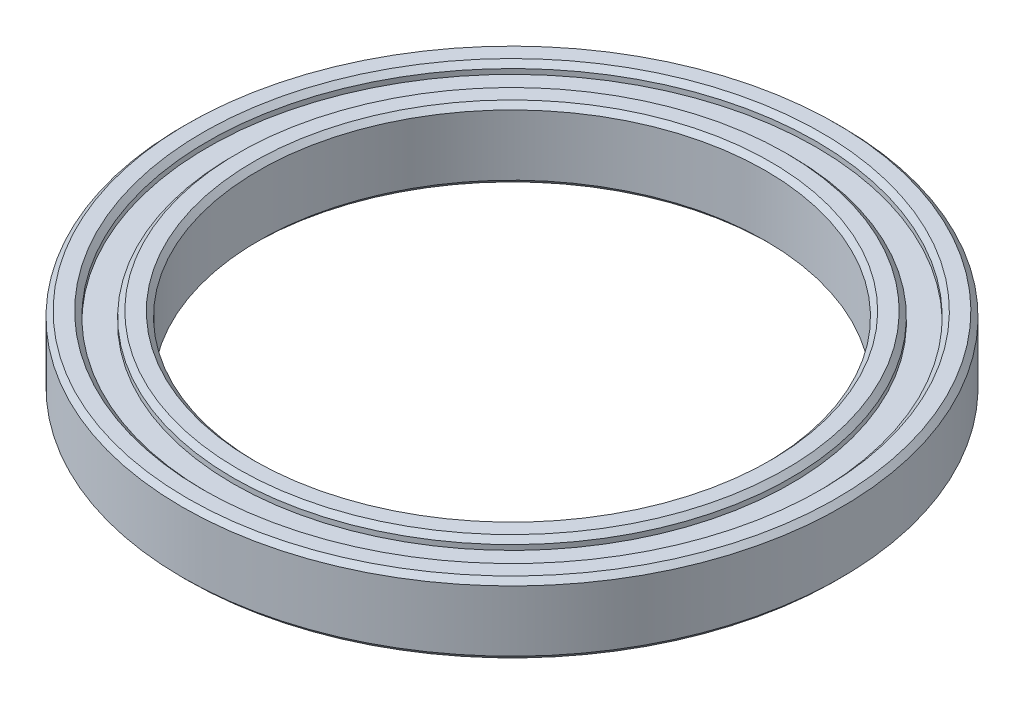
ISO-10303-21;
HEADER;
FILE_DESCRIPTION(('STEP AP214'),'2;1');
FILE_NAME('part.step','',(''),(''),'','','');
FILE_SCHEMA(('AUTOMOTIVE_DESIGN { 1 0 10303 214 1 1 1 1 }'));
ENDSEC;
DATA;
#1=APPLICATION_CONTEXT('core data for automotive mechanical design processes');
#2=APPLICATION_PROTOCOL_DEFINITION('international standard','automotive_design',2000,#1);
#3=PRODUCT_CONTEXT('',#1,'mechanical');
#4=PRODUCT('Part','Part','',(#3));
#5=PRODUCT_RELATED_PRODUCT_CATEGORY('part','',(#4));
#6=PRODUCT_DEFINITION_FORMATION('','',#4);
#7=PRODUCT_DEFINITION_CONTEXT('part definition',#1,'design');
#8=PRODUCT_DEFINITION('design','',#6,#7);
#9=PRODUCT_DEFINITION_SHAPE('','',#8);
#10=(LENGTH_UNIT() NAMED_UNIT(*) SI_UNIT(.MILLI.,.METRE.));
#11=(NAMED_UNIT(*) PLANE_ANGLE_UNIT() SI_UNIT($,.RADIAN.));
#12=(NAMED_UNIT(*) SI_UNIT($,.STERADIAN.) SOLID_ANGLE_UNIT());
#13=UNCERTAINTY_MEASURE_WITH_UNIT(LENGTH_MEASURE(1.E-05),#10,'distance_accuracy_value','');
#14=(GEOMETRIC_REPRESENTATION_CONTEXT(3) GLOBAL_UNCERTAINTY_ASSIGNED_CONTEXT((#13)) GLOBAL_UNIT_ASSIGNED_CONTEXT((#10,
#11,#12)) REPRESENTATION_CONTEXT('',''));
#15=CARTESIAN_POINT('',(0.,0.,0.));
#16=DIRECTION('',(0.,0.,1.));
#17=DIRECTION('',(1.,0.,0.));
#18=AXIS2_PLACEMENT_3D('',#15,#16,#17);
#19=CARTESIAN_POINT('',(0.,0.,0.));
#20=DIRECTION('',(0.,1.,0.));
#21=DIRECTION('',(0.,0.,1.));
#22=AXIS2_PLACEMENT_3D('',#19,#20,#21);
#23=PLANE('',#22);
#24=CARTESIAN_POINT('',(0.,0.,0.));
#25=DIRECTION('',(0.,1.,0.));
#26=DIRECTION('',(0.,0.,1.));
#27=AXIS2_PLACEMENT_3D('',#24,#25,#26);
#28=CIRCLE('',#27,27.);
#29=CARTESIAN_POINT('',(0.,0.,27.));
#30=VERTEX_POINT('',#29);
#31=EDGE_CURVE('E94',#30,#30,#28,.F.);
#32=ORIENTED_EDGE('',*,*,#31,.T.);
#33=EDGE_LOOP('',(#32));
#34=FACE_BOUND('',#33,.T.);
#35=CARTESIAN_POINT('',(0.,0.,0.));
#36=DIRECTION('',(0.,1.,0.));
#37=DIRECTION('',(0.,0.,1.));
#38=AXIS2_PLACEMENT_3D('',#35,#36,#37);
#39=CIRCLE('',#38,25.5);
#40=CARTESIAN_POINT('',(0.,0.,25.5));
#41=VERTEX_POINT('',#40);
#42=EDGE_CURVE('E97',#41,#41,#39,.T.);
#43=ORIENTED_EDGE('',*,*,#42,.T.);
#44=EDGE_LOOP('',(#43));
#45=FACE_BOUND('',#44,.T.);
#46=ADVANCED_FACE('F43',(#34,#45),#23,.F.);
#47=CARTESIAN_POINT('',(0.,7.,0.));
#48=DIRECTION('',(0.,1.,0.));
#49=DIRECTION('',(0.,0.,1.));
#50=AXIS2_PLACEMENT_3D('',#47,#48,#49);
#51=PLANE('',#50);
#52=CARTESIAN_POINT('',(0.,7.,0.));
#53=DIRECTION('',(0.,1.,0.));
#54=DIRECTION('',(0.,0.,1.));
#55=AXIS2_PLACEMENT_3D('',#52,#53,#54);
#56=CIRCLE('',#55,27.);
#57=CARTESIAN_POINT('',(0.,7.,27.));
#58=VERTEX_POINT('',#57);
#59=EDGE_CURVE('E51',#58,#58,#56,.T.);
#60=ORIENTED_EDGE('',*,*,#59,.T.);
#61=EDGE_LOOP('',(#60));
#62=FACE_BOUND('',#61,.T.);
#63=CARTESIAN_POINT('',(0.,7.,0.));
#64=DIRECTION('',(0.,1.,0.));
#65=DIRECTION('',(0.,0.,1.));
#66=AXIS2_PLACEMENT_3D('',#63,#64,#65);
#67=CIRCLE('',#66,25.5);
#68=CARTESIAN_POINT('',(0.,7.,25.5));
#69=VERTEX_POINT('',#68);
#70=EDGE_CURVE('E55',#69,#69,#67,.F.);
#71=ORIENTED_EDGE('',*,*,#70,.T.);
#72=EDGE_LOOP('',(#71));
#73=FACE_BOUND('',#72,.T.);
#74=ADVANCED_FACE('F133',(#62,#73),#51,.T.);
#75=CARTESIAN_POINT('',(0.,7.,0.));
#76=DIRECTION('',(0.,1.,0.));
#77=DIRECTION('',(0.,0.,1.));
#78=AXIS2_PLACEMENT_3D('',#75,#76,#77);
#79=CIRCLE('',#78,32.);
#80=CARTESIAN_POINT('',(0.,7.,32.));
#81=VERTEX_POINT('',#80);
#82=EDGE_CURVE('E64',#81,#81,#79,.T.);
#83=ORIENTED_EDGE('',*,*,#82,.T.);
#84=EDGE_LOOP('',(#83));
#85=FACE_BOUND('',#84,.T.);
#86=CARTESIAN_POINT('',(0.,7.,0.));
#87=DIRECTION('',(0.,1.,0.));
#88=DIRECTION('',(0.,0.,1.));
#89=AXIS2_PLACEMENT_3D('',#86,#87,#88);
#90=CIRCLE('',#89,30.5);
#91=CARTESIAN_POINT('',(0.,7.,30.5));
#92=VERTEX_POINT('',#91);
#93=EDGE_CURVE('E67',#92,#92,#90,.F.);
#94=ORIENTED_EDGE('',*,*,#93,.T.);
#95=EDGE_LOOP('',(#94));
#96=FACE_BOUND('',#95,.T.);
#97=ADVANCED_FACE('F140',(#85,#96),#51,.T.);
#98=CARTESIAN_POINT('',(0.,0.,0.));
#99=DIRECTION('',(0.,1.,0.));
#100=DIRECTION('',(0.,0.,1.));
#101=AXIS2_PLACEMENT_3D('',#98,#99,#100);
#102=CIRCLE('',#101,32.);
#103=CARTESIAN_POINT('',(0.,0.,32.));
#104=VERTEX_POINT('',#103);
#105=EDGE_CURVE('E73',#104,#104,#102,.F.);
#106=ORIENTED_EDGE('',*,*,#105,.T.);
#107=EDGE_LOOP('',(#106));
#108=FACE_BOUND('',#107,.T.);
#109=CARTESIAN_POINT('',(0.,0.,0.));
#110=DIRECTION('',(0.,1.,0.));
#111=DIRECTION('',(0.,0.,1.));
#112=AXIS2_PLACEMENT_3D('',#109,#110,#111);
#113=CIRCLE('',#112,30.5);
#114=CARTESIAN_POINT('',(0.,0.,30.5));
#115=VERTEX_POINT('',#114);
#116=EDGE_CURVE('E76',#115,#115,#113,.T.);
#117=ORIENTED_EDGE('',*,*,#116,.T.);
#118=EDGE_LOOP('',(#117));
#119=FACE_BOUND('',#118,.T.);
#120=ADVANCED_FACE('F136',(#108,#119),#23,.F.);
#121=CARTESIAN_POINT('',(0.,7.,0.));
#122=DIRECTION('',(0.,-1.,0.));
#123=DIRECTION('',(0.,0.,-1.));
#124=AXIS2_PLACEMENT_3D('',#121,#122,#123);
#125=CYLINDRICAL_SURFACE('',#124,32.5);
#126=CARTESIAN_POINT('',(0.,0.499999999999994,0.));
#127=DIRECTION('',(0.,1.,0.));
#128=DIRECTION('',(0.,0.,1.));
#129=AXIS2_PLACEMENT_3D('',#126,#127,#128);
#130=CIRCLE('',#129,32.5);
#131=CARTESIAN_POINT('',(0.,0.499999999999994,32.5));
#132=VERTEX_POINT('',#131);
#133=EDGE_CURVE('E79',#132,#132,#130,.T.);
#134=ORIENTED_EDGE('',*,*,#133,.T.);
#135=EDGE_LOOP('',(#134));
#136=FACE_BOUND('',#135,.T.);
#137=CARTESIAN_POINT('',(0.,6.5,0.));
#138=DIRECTION('',(0.,1.,0.));
#139=DIRECTION('',(0.,0.,1.));
#140=AXIS2_PLACEMENT_3D('',#137,#138,#139);
#141=CIRCLE('',#140,32.5);
#142=CARTESIAN_POINT('',(0.,6.5,32.5));
#143=VERTEX_POINT('',#142);
#144=EDGE_CURVE('E82',#143,#143,#141,.F.);
#145=ORIENTED_EDGE('',*,*,#144,.T.);
#146=EDGE_LOOP('',(#145));
#147=FACE_BOUND('',#146,.T.);
#148=ADVANCED_FACE('F145',(#136,#147),#125,.T.);
#149=CARTESIAN_POINT('',(0.,7.,0.));
#150=DIRECTION('',(0.,-1.,0.));
#151=DIRECTION('',(0.,0.,-1.));
#152=AXIS2_PLACEMENT_3D('',#149,#150,#151);
#153=CYLINDRICAL_SURFACE('',#152,25.);
#154=CARTESIAN_POINT('',(0.,0.500000000000007,0.));
#155=DIRECTION('',(0.,1.,0.));
#156=DIRECTION('',(0.,0.,1.));
#157=AXIS2_PLACEMENT_3D('',#154,#155,#156);
#158=CIRCLE('',#157,25.);
#159=CARTESIAN_POINT('',(0.,0.500000000000007,25.));
#160=VERTEX_POINT('',#159);
#161=EDGE_CURVE('E85',#160,#160,#158,.F.);
#162=ORIENTED_EDGE('',*,*,#161,.T.);
#163=EDGE_LOOP('',(#162));
#164=FACE_BOUND('',#163,.T.);
#165=CARTESIAN_POINT('',(0.,6.49999999999997,0.));
#166=DIRECTION('',(0.,1.,0.));
#167=DIRECTION('',(0.,0.,1.));
#168=AXIS2_PLACEMENT_3D('',#165,#166,#167);
#169=CIRCLE('',#168,25.);
#170=CARTESIAN_POINT('',(0.,6.49999999999997,25.));
#171=VERTEX_POINT('',#170);
#172=EDGE_CURVE('E88',#171,#171,#169,.T.);
#173=ORIENTED_EDGE('',*,*,#172,.T.);
#174=EDGE_LOOP('',(#173));
#175=FACE_BOUND('',#174,.T.);
#176=ADVANCED_FACE('F151',(#164,#175),#153,.F.);
#177=CARTESIAN_POINT('',(0.,6.,0.));
#178=DIRECTION('',(0.,1.,0.));
#179=DIRECTION('',(0.,0.,1.));
#180=AXIS2_PLACEMENT_3D('',#177,#178,#179);
#181=CYLINDRICAL_SURFACE('',#180,30.);
#182=CARTESIAN_POINT('',(0.,6.49999999999996,0.));
#183=DIRECTION('',(0.,1.,0.));
#184=DIRECTION('',(0.,0.,1.));
#185=AXIS2_PLACEMENT_3D('',#182,#183,#184);
#186=CIRCLE('',#185,30.);
#187=CARTESIAN_POINT('',(0.,6.49999999999996,30.));
#188=VERTEX_POINT('',#187);
#189=EDGE_CURVE('E59',#188,#188,#186,.T.);
#190=ORIENTED_EDGE('',*,*,#189,.T.);
#191=EDGE_LOOP('',(#190));
#192=FACE_BOUND('',#191,.T.);
#193=CARTESIAN_POINT('',(0.,6.,0.));
#194=DIRECTION('',(0.,1.,0.));
#195=DIRECTION('',(0.,0.,1.));
#196=AXIS2_PLACEMENT_3D('',#193,#194,#195);
#197=CIRCLE('',#196,30.);
#198=CARTESIAN_POINT('',(0.,6.,30.));
#199=VERTEX_POINT('',#198);
#200=EDGE_CURVE('E100',#199,#199,#197,.T.);
#201=ORIENTED_EDGE('',*,*,#200,.F.);
#202=EDGE_LOOP('',(#201));
#203=FACE_BOUND('',#202,.T.);
#204=ADVANCED_FACE('F207',(#192,#203),#181,.F.);
#205=CARTESIAN_POINT('',(0.,6.,0.));
#206=DIRECTION('',(0.,1.,0.));
#207=DIRECTION('',(0.,0.,1.));
#208=AXIS2_PLACEMENT_3D('',#205,#206,#207);
#209=PLANE('',#208);
#210=CARTESIAN_POINT('',(0.,6.,0.));
#211=DIRECTION('',(0.,1.,0.));
#212=DIRECTION('',(0.,0.,1.));
#213=AXIS2_PLACEMENT_3D('',#210,#211,#212);
#214=CIRCLE('',#213,27.5);
#215=CARTESIAN_POINT('',(0.,6.,27.5));
#216=VERTEX_POINT('',#215);
#217=EDGE_CURVE('E103',#216,#216,#214,.T.);
#218=ORIENTED_EDGE('',*,*,#217,.F.);
#219=EDGE_LOOP('',(#218));
#220=FACE_BOUND('',#219,.T.);
#221=ORIENTED_EDGE('',*,*,#200,.T.);
#222=EDGE_LOOP('',(#221));
#223=FACE_BOUND('',#222,.T.);
#224=ADVANCED_FACE('F130',(#220,#223),#209,.T.);
#225=CARTESIAN_POINT('',(0.,6.,0.));
#226=DIRECTION('',(0.,1.,0.));
#227=DIRECTION('',(0.,0.,1.));
#228=AXIS2_PLACEMENT_3D('',#225,#226,#227);
#229=CYLINDRICAL_SURFACE('',#228,27.5);
#230=CARTESIAN_POINT('',(0.,6.49999999999997,0.));
#231=DIRECTION('',(0.,1.,0.));
#232=DIRECTION('',(0.,0.,1.));
#233=AXIS2_PLACEMENT_3D('',#230,#231,#232);
#234=CIRCLE('',#233,27.5);
#235=CARTESIAN_POINT('',(0.,6.49999999999997,27.5));
#236=VERTEX_POINT('',#235);
#237=EDGE_CURVE('E10',#236,#236,#234,.F.);
#238=ORIENTED_EDGE('',*,*,#237,.T.);
#239=EDGE_LOOP('',(#238));
#240=FACE_BOUND('',#239,.T.);
#241=ORIENTED_EDGE('',*,*,#217,.T.);
#242=EDGE_LOOP('',(#241));
#243=FACE_BOUND('',#242,.T.);
#244=ADVANCED_FACE('F123',(#240,#243),#229,.T.);
#245=CARTESIAN_POINT('',(0.,1.,0.));
#246=DIRECTION('',(0.,-1.,0.));
#247=DIRECTION('',(0.,0.,-1.));
#248=AXIS2_PLACEMENT_3D('',#245,#246,#247);
#249=CYLINDRICAL_SURFACE('',#248,30.);
#250=CARTESIAN_POINT('',(0.,0.499999999999983,0.));
#251=DIRECTION('',(0.,1.,0.));
#252=DIRECTION('',(0.,0.,1.));
#253=AXIS2_PLACEMENT_3D('',#250,#251,#252);
#254=CIRCLE('',#253,30.);
#255=CARTESIAN_POINT('',(0.,0.499999999999983,30.));
#256=VERTEX_POINT('',#255);
#257=EDGE_CURVE('E70',#256,#256,#254,.F.);
#258=ORIENTED_EDGE('',*,*,#257,.T.);
#259=EDGE_LOOP('',(#258));
#260=FACE_BOUND('',#259,.T.);
#261=CARTESIAN_POINT('',(0.,1.,0.));
#262=DIRECTION('',(0.,-1.,0.));
#263=DIRECTION('',(0.,0.,-1.));
#264=AXIS2_PLACEMENT_3D('',#261,#262,#263);
#265=CIRCLE('',#264,30.);
#266=CARTESIAN_POINT('',(0.,1.,-30.));
#267=VERTEX_POINT('',#266);
#268=EDGE_CURVE('E106',#267,#267,#265,.T.);
#269=ORIENTED_EDGE('',*,*,#268,.F.);
#270=EDGE_LOOP('',(#269));
#271=FACE_BOUND('',#270,.T.);
#272=ADVANCED_FACE('F118',(#260,#271),#249,.F.);
#273=CARTESIAN_POINT('',(0.,1.,0.));
#274=DIRECTION('',(0.,-1.,0.));
#275=DIRECTION('',(0.,0.,-1.));
#276=AXIS2_PLACEMENT_3D('',#273,#274,#275);
#277=PLANE('',#276);
#278=CARTESIAN_POINT('',(0.,1.,0.));
#279=DIRECTION('',(0.,-1.,0.));
#280=DIRECTION('',(0.,0.,-1.));
#281=AXIS2_PLACEMENT_3D('',#278,#279,#280);
#282=CIRCLE('',#281,27.5);
#283=CARTESIAN_POINT('',(0.,1.,-27.5));
#284=VERTEX_POINT('',#283);
#285=EDGE_CURVE('E109',#284,#284,#282,.T.);
#286=ORIENTED_EDGE('',*,*,#285,.F.);
#287=EDGE_LOOP('',(#286));
#288=FACE_BOUND('',#287,.T.);
#289=ORIENTED_EDGE('',*,*,#268,.T.);
#290=EDGE_LOOP('',(#289));
#291=FACE_BOUND('',#290,.T.);
#292=ADVANCED_FACE('F115',(#288,#291),#277,.T.);
#293=CARTESIAN_POINT('',(0.,1.,0.));
#294=DIRECTION('',(0.,-1.,0.));
#295=DIRECTION('',(0.,0.,-1.));
#296=AXIS2_PLACEMENT_3D('',#293,#294,#295);
#297=CYLINDRICAL_SURFACE('',#296,27.5);
#298=CARTESIAN_POINT('',(0.,0.500000000000028,0.));
#299=DIRECTION('',(0.,1.,0.));
#300=DIRECTION('',(0.,0.,1.));
#301=AXIS2_PLACEMENT_3D('',#298,#299,#300);
#302=CIRCLE('',#301,27.5);
#303=CARTESIAN_POINT('',(0.,0.500000000000028,27.5));
#304=VERTEX_POINT('',#303);
#305=EDGE_CURVE('E91',#304,#304,#302,.T.);
#306=ORIENTED_EDGE('',*,*,#305,.T.);
#307=EDGE_LOOP('',(#306));
#308=FACE_BOUND('',#307,.T.);
#309=ORIENTED_EDGE('',*,*,#285,.T.);
#310=EDGE_LOOP('',(#309));
#311=FACE_BOUND('',#310,.T.);
#312=ADVANCED_FACE('F113',(#308,#311),#297,.T.);
#313=CARTESIAN_POINT('',(0.,0.,0.));
#314=DIRECTION('',(0.,1.,0.));
#315=DIRECTION('',(0.,0.,1.));
#316=AXIS2_PLACEMENT_3D('',#313,#314,#315);
#317=CONICAL_SURFACE('',#316,27.,0.785398163397441);
#318=ORIENTED_EDGE('',*,*,#305,.F.);
#319=EDGE_LOOP('',(#318));
#320=FACE_BOUND('',#319,.T.);
#321=ORIENTED_EDGE('',*,*,#31,.F.);
#322=EDGE_LOOP('',(#321));
#323=FACE_BOUND('',#322,.T.);
#324=ADVANCED_FACE('F245',(#320,#323),#317,.T.);
#325=CARTESIAN_POINT('',(0.,0.,0.));
#326=DIRECTION('',(0.,-1.,0.));
#327=DIRECTION('',(0.,0.,-1.));
#328=AXIS2_PLACEMENT_3D('',#325,#326,#327);
#329=CONICAL_SURFACE('',#328,25.5,0.785398163397441);
#330=ORIENTED_EDGE('',*,*,#161,.F.);
#331=EDGE_LOOP('',(#330));
#332=FACE_BOUND('',#331,.T.);
#333=ORIENTED_EDGE('',*,*,#42,.F.);
#334=EDGE_LOOP('',(#333));
#335=FACE_BOUND('',#334,.T.);
#336=ADVANCED_FACE('F172',(#332,#335),#329,.F.);
#337=CARTESIAN_POINT('',(0.,0.499999999999994,0.));
#338=DIRECTION('',(0.,1.,0.));
#339=DIRECTION('',(0.,0.,1.));
#340=AXIS2_PLACEMENT_3D('',#337,#338,#339);
#341=CONICAL_SURFACE('',#340,32.5,0.785398163397455);
#342=ORIENTED_EDGE('',*,*,#105,.F.);
#343=EDGE_LOOP('',(#342));
#344=FACE_BOUND('',#343,.T.);
#345=ORIENTED_EDGE('',*,*,#133,.F.);
#346=EDGE_LOOP('',(#345));
#347=FACE_BOUND('',#346,.T.);
#348=ADVANCED_FACE('F162',(#344,#347),#341,.T.);
#349=CARTESIAN_POINT('',(0.,0.499999999999983,0.));
#350=DIRECTION('',(0.,-1.,0.));
#351=DIRECTION('',(0.,0.,-1.));
#352=AXIS2_PLACEMENT_3D('',#349,#350,#351);
#353=CONICAL_SURFACE('',#352,30.,0.785398163397455);
#354=ORIENTED_EDGE('',*,*,#116,.F.);
#355=EDGE_LOOP('',(#354));
#356=FACE_BOUND('',#355,.T.);
#357=ORIENTED_EDGE('',*,*,#257,.F.);
#358=EDGE_LOOP('',(#357));
#359=FACE_BOUND('',#358,.T.);
#360=ADVANCED_FACE('F158',(#356,#359),#353,.F.);
#361=CARTESIAN_POINT('',(0.,7.,0.));
#362=DIRECTION('',(0.,-1.,0.));
#363=DIRECTION('',(0.,0.,-1.));
#364=AXIS2_PLACEMENT_3D('',#361,#362,#363);
#365=CONICAL_SURFACE('',#364,32.,0.785398163397462);
#366=ORIENTED_EDGE('',*,*,#144,.F.);
#367=EDGE_LOOP('',(#366));
#368=FACE_BOUND('',#367,.T.);
#369=ORIENTED_EDGE('',*,*,#82,.F.);
#370=EDGE_LOOP('',(#369));
#371=FACE_BOUND('',#370,.T.);
#372=ADVANCED_FACE('F161',(#368,#371),#365,.T.);
#373=CARTESIAN_POINT('',(0.,6.49999999999996,0.));
#374=DIRECTION('',(0.,1.,0.));
#375=DIRECTION('',(0.,0.,1.));
#376=AXIS2_PLACEMENT_3D('',#373,#374,#375);
#377=CONICAL_SURFACE('',#376,30.,0.785398163397455);
#378=ORIENTED_EDGE('',*,*,#93,.F.);
#379=EDGE_LOOP('',(#378));
#380=FACE_BOUND('',#379,.T.);
#381=ORIENTED_EDGE('',*,*,#189,.F.);
#382=EDGE_LOOP('',(#381));
#383=FACE_BOUND('',#382,.T.);
#384=ADVANCED_FACE('F169',(#380,#383),#377,.F.);
#385=CARTESIAN_POINT('',(0.,7.,0.));
#386=DIRECTION('',(0.,-1.,0.));
#387=DIRECTION('',(0.,0.,-1.));
#388=AXIS2_PLACEMENT_3D('',#385,#386,#387);
#389=CONICAL_SURFACE('',#388,27.,0.785398163397441);
#390=ORIENTED_EDGE('',*,*,#237,.F.);
#391=EDGE_LOOP('',(#390));
#392=FACE_BOUND('',#391,.T.);
#393=ORIENTED_EDGE('',*,*,#59,.F.);
#394=EDGE_LOOP('',(#393));
#395=FACE_BOUND('',#394,.T.);
#396=ADVANCED_FACE('F189',(#392,#395),#389,.T.);
#397=CARTESIAN_POINT('',(0.,6.49999999999997,0.));
#398=DIRECTION('',(0.,1.,0.));
#399=DIRECTION('',(0.,0.,1.));
#400=AXIS2_PLACEMENT_3D('',#397,#398,#399);
#401=CONICAL_SURFACE('',#400,25.,0.785398163397441);
#402=ORIENTED_EDGE('',*,*,#70,.F.);
#403=EDGE_LOOP('',(#402));
#404=FACE_BOUND('',#403,.T.);
#405=ORIENTED_EDGE('',*,*,#172,.F.);
#406=EDGE_LOOP('',(#405));
#407=FACE_BOUND('',#406,.T.);
#408=ADVANCED_FACE('F46',(#404,#407),#401,.F.);
#409=CLOSED_SHELL('',(#46,#74,#97,#120,#148,#176,#204,#224,#244,#272,#292,#312,#324,#336,#348,
#360,#372,#384,#396,#408));
#410=MANIFOLD_SOLID_BREP('B2',#409);
#411=ADVANCED_BREP_SHAPE_REPRESENTATION('',(#18,#410),#14);
#412=SHAPE_DEFINITION_REPRESENTATION(#9,#411);
ENDSEC;
END-ISO-10303-21;
